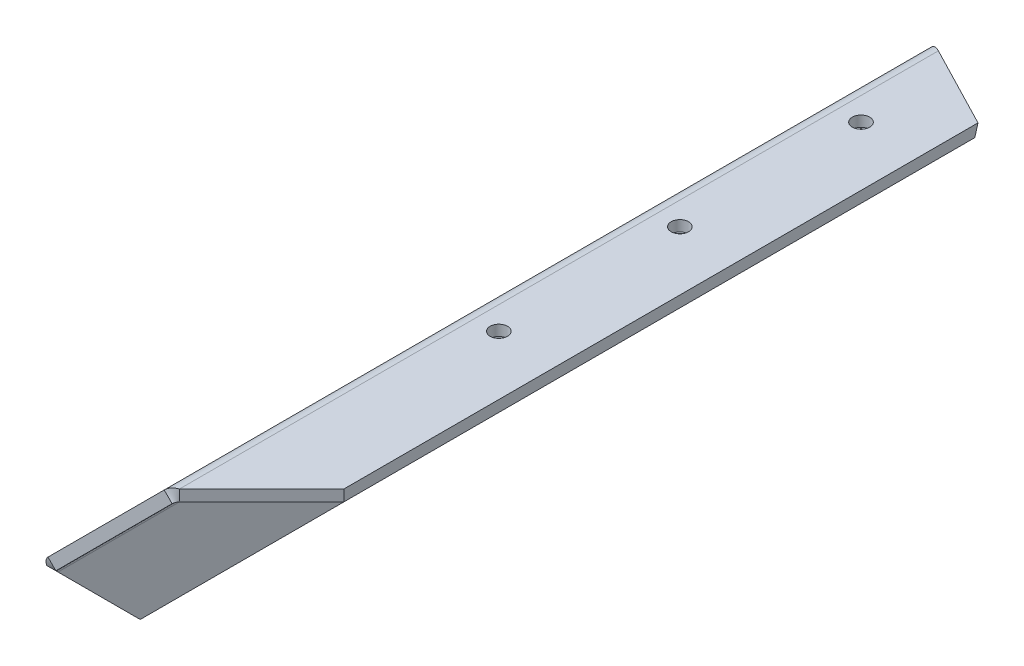
ISO-10303-21;
HEADER;
FILE_DESCRIPTION(('STEP AP214'),'2;1');
FILE_NAME('part.step','',(''),(''),'','','');
FILE_SCHEMA(('AUTOMOTIVE_DESIGN { 1 0 10303 214 1 1 1 1 }'));
ENDSEC;
DATA;
#1=APPLICATION_CONTEXT('core data for automotive mechanical design processes');
#2=APPLICATION_PROTOCOL_DEFINITION('international standard','automotive_design',2000,#1);
#3=PRODUCT_CONTEXT('',#1,'mechanical');
#4=PRODUCT('Part','Part','',(#3));
#5=PRODUCT_RELATED_PRODUCT_CATEGORY('part','',(#4));
#6=PRODUCT_DEFINITION_FORMATION('','',#4);
#7=PRODUCT_DEFINITION_CONTEXT('part definition',#1,'design');
#8=PRODUCT_DEFINITION('design','',#6,#7);
#9=PRODUCT_DEFINITION_SHAPE('','',#8);
#10=(LENGTH_UNIT() NAMED_UNIT(*) SI_UNIT(.MILLI.,.METRE.));
#11=(NAMED_UNIT(*) PLANE_ANGLE_UNIT() SI_UNIT($,.RADIAN.));
#12=(NAMED_UNIT(*) SI_UNIT($,.STERADIAN.) SOLID_ANGLE_UNIT());
#13=UNCERTAINTY_MEASURE_WITH_UNIT(LENGTH_MEASURE(1.E-05),#10,'distance_accuracy_value','');
#14=(GEOMETRIC_REPRESENTATION_CONTEXT(3) GLOBAL_UNCERTAINTY_ASSIGNED_CONTEXT((#13)) GLOBAL_UNIT_ASSIGNED_CONTEXT((#10,
#11,#12)) REPRESENTATION_CONTEXT('',''));
#15=CARTESIAN_POINT('',(0.,0.,0.));
#16=DIRECTION('',(0.,0.,1.));
#17=DIRECTION('',(1.,0.,0.));
#18=AXIS2_PLACEMENT_3D('',#15,#16,#17);
#19=CARTESIAN_POINT('',(-93.8086894866069,111.769201728745,112.900713999999));
#20=DIRECTION('',(0.707106781186544,-0.707106781186551,0.));
#21=DIRECTION('',(0.,0.,-1.));
#22=AXIS2_PLACEMENT_3D('',#19,#20,#21);
#23=PLANE('',#22);
#24=DIRECTION('',(0.,0.,-1.));
#25=VECTOR('',#24,1.);
#26=CARTESIAN_POINT('',(-111.084768855022,94.4931223603303,-112.900714000001));
#27=LINE('',#26,#25);
#28=CARTESIAN_POINT('',(-111.084768855022,94.4931223603303,-17.956016192537));
#29=VERTEX_POINT('',#28);
#30=CARTESIAN_POINT('',(-111.084768855022,94.4931223603304,94.4931223603293));
#31=VERTEX_POINT('',#30);
#32=EDGE_CURVE('E36',#29,#31,#27,.F.);
#33=ORIENTED_EDGE('',*,*,#32,.F.);
#34=DIRECTION('',(0.697714169620552,0.697714169620545,0.162449607637007));
#35=VECTOR('',#34,1.);
#36=CARTESIAN_POINT('',(-79.4328572523152,126.145033963037,-10.5864645269641));
#37=LINE('',#36,#35);
#38=CARTESIAN_POINT('',(-94.4931223603302,111.084768855022,-14.092963698447));
#39=VERTEX_POINT('',#38);
#40=EDGE_CURVE('E210',#29,#39,#37,.T.);
#41=ORIENTED_EDGE('',*,*,#40,.T.);
#42=DIRECTION('',(0.,0.,1.));
#43=VECTOR('',#42,1.);
#44=CARTESIAN_POINT('',(-94.4931223603302,111.084768855022,112.900713999999));
#45=LINE('',#44,#43);
#46=CARTESIAN_POINT('',(-94.4931223603302,111.084768855022,94.4931223603293));
#47=VERTEX_POINT('',#46);
#48=EDGE_CURVE('E104',#47,#39,#45,.F.);
#49=ORIENTED_EDGE('',*,*,#48,.F.);
#50=DIRECTION('',(-0.707106781186551,-0.707106781186544,0.));
#51=VECTOR('',#50,1.);
#52=CARTESIAN_POINT('',(-94.4931223603302,111.084768855022,94.4931223603293));
#53=LINE('',#52,#51);
#54=EDGE_CURVE('E228',#47,#31,#53,.T.);
#55=ORIENTED_EDGE('',*,*,#54,.T.);
#56=EDGE_LOOP('',(#33,#41,#49,#55));
#57=FACE_BOUND('',#56,.T.);
#58=ADVANCED_FACE('F32',(#57),#23,.T.);
#59=CARTESIAN_POINT('',(-94.9402017578616,112.900714,112.900713999999));
#60=DIRECTION('',(0.707106781186544,-0.707106781186551,0.));
#61=DIRECTION('',(0.,0.,-1.));
#62=AXIS2_PLACEMENT_3D('',#59,#60,#61);
#63=PLANE('',#62);
#64=DIRECTION('',(0.697714169620552,0.697714169620545,0.162449607637007));
#65=VECTOR('',#64,1.);
#66=CARTESIAN_POINT('',(-80.4613330721496,127.379582685712,-11.471538897891));
#67=LINE('',#66,#65);
#68=CARTESIAN_POINT('',(-112.216281126277,95.6246346315851,-18.8650806611778));
#69=VERTEX_POINT('',#68);
#70=CARTESIAN_POINT('',(-95.6246346315849,112.216281126277,-15.0020281670877));
#71=VERTEX_POINT('',#70);
#72=EDGE_CURVE('E207',#69,#71,#67,.T.);
#73=ORIENTED_EDGE('',*,*,#72,.F.);
#74=DIRECTION('',(0.,0.,-1.));
#75=VECTOR('',#74,1.);
#76=CARTESIAN_POINT('',(-112.216281126277,95.6246346315851,-112.900714000001));
#77=LINE('',#76,#75);
#78=CARTESIAN_POINT('',(-112.216281126277,95.6246346315851,94.4931223603293));
#79=VERTEX_POINT('',#78);
#80=EDGE_CURVE('E42',#69,#79,#77,.F.);
#81=ORIENTED_EDGE('',*,*,#80,.T.);
#82=DIRECTION('',(0.707106781186551,0.707106781186544,0.));
#83=VECTOR('',#82,1.);
#84=CARTESIAN_POINT('',(-94.9402017578616,112.900714,94.4931223603293));
#85=LINE('',#84,#83);
#86=CARTESIAN_POINT('',(-95.6246346315849,112.216281126277,94.4931223603293));
#87=VERTEX_POINT('',#86);
#88=EDGE_CURVE('E229',#87,#79,#85,.F.);
#89=ORIENTED_EDGE('',*,*,#88,.F.);
#90=DIRECTION('',(0.,0.,1.));
#91=VECTOR('',#90,1.);
#92=CARTESIAN_POINT('',(-95.6246346315849,112.216281126277,112.900713999999));
#93=LINE('',#92,#91);
#94=EDGE_CURVE('E110',#87,#71,#93,.F.);
#95=ORIENTED_EDGE('',*,*,#94,.T.);
#96=EDGE_LOOP('',(#73,#81,#89,#95));
#97=FACE_BOUND('',#96,.T.);
#98=ADVANCED_FACE('F34',(#97),#63,.F.);
#99=CARTESIAN_POINT('',(-93.9722675053082,110.563914,112.900713999999));
#100=DIRECTION('',(0.,0.,1.));
#101=DIRECTION('',(0.,1.,0.));
#102=AXIS2_PLACEMENT_3D('',#99,#100,#101);
#103=CYLINDRICAL_SURFACE('',#102,2.3368);
#104=DIRECTION('',(0.,0.,1.));
#105=VECTOR('',#104,1.);
#106=CARTESIAN_POINT('',(-93.9722675053082,112.900714,-112.900714000001));
#107=LINE('',#106,#105);
#108=CARTESIAN_POINT('',(-93.9722675053082,112.900714,93.9722675053073));
#109=VERTEX_POINT('',#108);
#110=CARTESIAN_POINT('',(-93.9722675053082,112.900714,-14.3411658246829));
#111=VERTEX_POINT('',#110);
#112=EDGE_CURVE('E96',#109,#111,#107,.F.);
#113=ORIENTED_EDGE('',*,*,#112,.T.);
#114=CARTESIAN_POINT('',(-93.9722675053082,110.563914,-13.6745054509774));
#115=DIRECTION('',(0.445952793407952,-0.245551475215283,-0.860715155595185));
#116=DIRECTION('',(0.753974155692041,-0.41515485257879,0.509086850084302));
#117=AXIS2_PLACEMENT_3D('',#114,#115,#116);
#118=ELLIPSE('',#117,2.7149516129806,2.3368);
#119=EDGE_CURVE('E216',#111,#71,#118,.F.);
#120=ORIENTED_EDGE('',*,*,#119,.T.);
#121=ORIENTED_EDGE('',*,*,#94,.F.);
#122=CARTESIAN_POINT('',(-93.9722675053082,110.563914,93.9722675053073));
#123=DIRECTION('',(-0.300635186420926,0.,-0.953739212093985));
#124=DIRECTION('',(-0.953739212093985,0.,0.300635186420926));
#125=AXIS2_PLACEMENT_3D('',#122,#123,#124);
#126=ELLIPSE('',#125,2.45014566913887,2.3368);
#127=EDGE_CURVE('E155',#109,#87,#126,.F.);
#128=ORIENTED_EDGE('',*,*,#127,.F.);
#129=EDGE_LOOP('',(#113,#120,#121,#128));
#130=FACE_BOUND('',#129,.T.);
#131=ADVANCED_FACE('F296',(#130),#103,.T.);
#132=CARTESIAN_POINT('',(-93.9722675053082,110.563914,112.900713999999));
#133=DIRECTION('',(0.,0.,1.));
#134=DIRECTION('',(0.,1.,0.));
#135=AXIS2_PLACEMENT_3D('',#132,#133,#134);
#136=CYLINDRICAL_SURFACE('',#135,0.736599999999998);
#137=CARTESIAN_POINT('',(-93.9722675053082,110.563914,-13.6745054509774));
#138=DIRECTION('',(0.445952793407952,-0.245551475215283,-0.860715155595185));
#139=DIRECTION('',(0.753974155692041,-0.41515485257879,0.509086850084302));
#140=AXIS2_PLACEMENT_3D('',#137,#138,#139);
#141=ELLIPSE('',#140,0.855799964961276,0.736599999999998);
#142=CARTESIAN_POINT('',(-93.9722675053082,111.300514,-13.8846483948628));
#143=VERTEX_POINT('',#142);
#144=EDGE_CURVE('E213',#143,#39,#141,.F.);
#145=ORIENTED_EDGE('',*,*,#144,.F.);
#146=DIRECTION('',(0.,0.,1.));
#147=VECTOR('',#146,1.);
#148=CARTESIAN_POINT('',(-93.9722675053082,111.300514,-112.900714000001));
#149=LINE('',#148,#147);
#150=CARTESIAN_POINT('',(-93.9722675053082,111.300514,93.9722675053073));
#151=VERTEX_POINT('',#150);
#152=EDGE_CURVE('E93',#143,#151,#149,.T.);
#153=ORIENTED_EDGE('',*,*,#152,.T.);
#154=CARTESIAN_POINT('',(-93.9722675053082,110.563914,93.9722675053073));
#155=DIRECTION('',(-0.707106781186546,0.,-0.707106781186549));
#156=DIRECTION('',(-0.707106781186549,0.,0.707106781186546));
#157=AXIS2_PLACEMENT_3D('',#154,#155,#156);
#158=ELLIPSE('',#157,1.04170971004402,0.736599999999998);
#159=EDGE_CURVE('E139',#151,#47,#158,.F.);
#160=ORIENTED_EDGE('',*,*,#159,.T.);
#161=ORIENTED_EDGE('',*,*,#48,.T.);
#162=EDGE_LOOP('',(#145,#153,#160,#161));
#163=FACE_BOUND('',#162,.T.);
#164=ADVANCED_FACE('F313',(#163),#136,.F.);
#165=CARTESIAN_POINT('',(-82.2402017578616,112.900714,-112.900714000001));
#166=DIRECTION('',(0.,-1.,0.));
#167=DIRECTION('',(1.,0.,0.));
#168=AXIS2_PLACEMENT_3D('',#165,#166,#167);
#169=PLANE('',#168);
#170=CARTESIAN_POINT('',(-90.675714,112.900714,-9.36190769008373E-13));
#171=DIRECTION('',(0.,1.,0.));
#172=DIRECTION('',(-1.,0.,0.));
#173=AXIS2_PLACEMENT_3D('',#170,#171,#172);
#174=CIRCLE('',#173,1.2446);
#175=CARTESIAN_POINT('',(-91.920314,112.900714,-9.35926266122143E-13));
#176=VERTEX_POINT('',#175);
#177=EDGE_CURVE('E144',#176,#176,#174,.T.);
#178=ORIENTED_EDGE('',*,*,#177,.F.);
#179=EDGE_LOOP('',(#178));
#180=FACE_BOUND('',#179,.T.);
#181=CARTESIAN_POINT('',(-90.675714,112.900714,25.8439284999991));
#182=DIRECTION('',(0.,1.,0.));
#183=DIRECTION('',(-1.,0.,0.));
#184=AXIS2_PLACEMENT_3D('',#181,#182,#183);
#185=CIRCLE('',#184,1.2446);
#186=CARTESIAN_POINT('',(-91.920314,112.900714,25.8439284999991));
#187=VERTEX_POINT('',#186);
#188=EDGE_CURVE('E149',#187,#187,#185,.T.);
#189=ORIENTED_EDGE('',*,*,#188,.F.);
#190=EDGE_LOOP('',(#189));
#191=FACE_BOUND('',#190,.T.);
#192=CARTESIAN_POINT('',(-90.675714,112.900714,51.6878569999991));
#193=DIRECTION('',(0.,1.,0.));
#194=DIRECTION('',(-1.,0.,0.));
#195=AXIS2_PLACEMENT_3D('',#192,#193,#194);
#196=CIRCLE('',#195,1.2446);
#197=CARTESIAN_POINT('',(-91.920314,112.900714,51.6878569999991));
#198=VERTEX_POINT('',#197);
#199=EDGE_CURVE('E232',#198,#198,#196,.T.);
#200=ORIENTED_EDGE('',*,*,#199,.F.);
#201=EDGE_LOOP('',(#200));
#202=FACE_BOUND('',#201,.T.);
#203=DIRECTION('',(0.887899482968571,0.,0.460037507323201));
#204=VECTOR('',#203,1.);
#205=CARTESIAN_POINT('',(-124.981441082724,112.900714,-30.4076048646206));
#206=LINE('',#205,#204);
#207=CARTESIAN_POINT('',(-82.2402017578616,112.900714,-8.26256077339663));
#208=VERTEX_POINT('',#207);
#209=EDGE_CURVE('E222',#111,#208,#206,.T.);
#210=ORIENTED_EDGE('',*,*,#209,.F.);
#211=ORIENTED_EDGE('',*,*,#112,.F.);
#212=DIRECTION('',(0.707106781186549,0.,-0.707106781186546));
#213=VECTOR('',#212,1.);
#214=CARTESIAN_POINT('',(15.3302561210693,112.900714,-15.3302561210697));
#215=LINE('',#214,#213);
#216=CARTESIAN_POINT('',(-82.2402017578616,112.900714,82.2402017578608));
#217=VERTEX_POINT('',#216);
#218=EDGE_CURVE('E251',#109,#217,#215,.T.);
#219=ORIENTED_EDGE('',*,*,#218,.T.);
#220=DIRECTION('',(0.,0.,-1.));
#221=VECTOR('',#220,1.);
#222=CARTESIAN_POINT('',(-82.2402017578616,112.900714,-112.900714000001));
#223=LINE('',#222,#221);
#224=EDGE_CURVE('E101',#217,#208,#223,.T.);
#225=ORIENTED_EDGE('',*,*,#224,.T.);
#226=EDGE_LOOP('',(#210,#211,#219,#225));
#227=FACE_BOUND('',#226,.T.);
#228=ADVANCED_FACE('F316',(#180,#191,#202,#227),#169,.F.);
#229=CARTESIAN_POINT('',(-82.2402017578616,111.300514,-112.900714000001));
#230=DIRECTION('',(0.,-1.,0.));
#231=DIRECTION('',(1.,0.,0.));
#232=AXIS2_PLACEMENT_3D('',#229,#230,#231);
#233=PLANE('',#232);
#234=CARTESIAN_POINT('',(-90.675714,111.300514,-9.36013111119972E-13));
#235=DIRECTION('',(0.,-1.,0.));
#236=DIRECTION('',(1.,0.,0.));
#237=AXIS2_PLACEMENT_3D('',#234,#235,#236);
#238=CIRCLE('',#237,1.11778190344489);
#239=CARTESIAN_POINT('',(-89.5579320965551,111.300514,-9.36250662573964E-13));
#240=VERTEX_POINT('',#239);
#241=EDGE_CURVE('E136',#240,#240,#238,.T.);
#242=ORIENTED_EDGE('',*,*,#241,.F.);
#243=EDGE_LOOP('',(#242));
#244=FACE_BOUND('',#243,.T.);
#245=CARTESIAN_POINT('',(-90.675714,111.300514,25.8439284999991));
#246=DIRECTION('',(0.,-1.,0.));
#247=DIRECTION('',(1.,0.,0.));
#248=AXIS2_PLACEMENT_3D('',#245,#246,#247);
#249=CIRCLE('',#248,1.11778190344489);
#250=CARTESIAN_POINT('',(-89.5579320965551,111.300514,25.8439284999991));
#251=VERTEX_POINT('',#250);
#252=EDGE_CURVE('E141',#251,#251,#249,.T.);
#253=ORIENTED_EDGE('',*,*,#252,.F.);
#254=EDGE_LOOP('',(#253));
#255=FACE_BOUND('',#254,.T.);
#256=CARTESIAN_POINT('',(-90.675714,111.300514,51.6878569999991));
#257=DIRECTION('',(0.,-1.,0.));
#258=DIRECTION('',(1.,0.,0.));
#259=AXIS2_PLACEMENT_3D('',#256,#257,#258);
#260=CIRCLE('',#259,1.11778190344489);
#261=CARTESIAN_POINT('',(-89.5579320965551,111.300514,51.6878569999991));
#262=VERTEX_POINT('',#261);
#263=EDGE_CURVE('E146',#262,#262,#260,.T.);
#264=ORIENTED_EDGE('',*,*,#263,.F.);
#265=EDGE_LOOP('',(#264));
#266=FACE_BOUND('',#265,.T.);
#267=ORIENTED_EDGE('',*,*,#152,.F.);
#268=DIRECTION('',(0.887899482968571,0.,0.460037507323201));
#269=VECTOR('',#268,1.);
#270=CARTESIAN_POINT('',(-125.167913417357,111.300514,-30.0477022765198));
#271=LINE('',#270,#269);
#272=CARTESIAN_POINT('',(-82.2402017578616,111.300514,-7.80604334357657));
#273=VERTEX_POINT('',#272);
#274=EDGE_CURVE('E219',#143,#273,#271,.T.);
#275=ORIENTED_EDGE('',*,*,#274,.T.);
#276=DIRECTION('',(0.,0.,1.));
#277=VECTOR('',#276,1.);
#278=CARTESIAN_POINT('',(-82.2402017578616,111.300514,-112.900714000001));
#279=LINE('',#278,#277);
#280=CARTESIAN_POINT('',(-82.2402017578616,111.300514,82.2402017578608));
#281=VERTEX_POINT('',#280);
#282=EDGE_CURVE('E105',#281,#273,#279,.F.);
#283=ORIENTED_EDGE('',*,*,#282,.F.);
#284=DIRECTION('',(0.707106781186549,0.,-0.707106781186546));
#285=VECTOR('',#284,1.);
#286=CARTESIAN_POINT('',(15.3302561210693,111.300514,-15.3302561210697));
#287=LINE('',#286,#285);
#288=EDGE_CURVE('E154',#151,#281,#287,.T.);
#289=ORIENTED_EDGE('',*,*,#288,.F.);
#290=EDGE_LOOP('',(#267,#275,#283,#289));
#291=FACE_BOUND('',#290,.T.);
#292=ADVANCED_FACE('F323',(#244,#255,#266,#291),#233,.T.);
#293=CARTESIAN_POINT('',(-82.2402017578616,112.900714,-112.900714000001));
#294=DIRECTION('',(-1.,0.,0.));
#295=DIRECTION('',(0.,-1.,0.));
#296=AXIS2_PLACEMENT_3D('',#293,#294,#295);
#297=PLANE('',#296);
#298=DIRECTION('',(0.,-0.961632224178945,0.274341876899344));
#299=VECTOR('',#298,1.);
#300=CARTESIAN_POINT('',(-82.2402017578616,140.505931908668,-16.1379908004483));
#301=LINE('',#300,#299);
#302=EDGE_CURVE('E225',#208,#273,#301,.T.);
#303=ORIENTED_EDGE('',*,*,#302,.F.);
#304=ORIENTED_EDGE('',*,*,#224,.F.);
#305=DIRECTION('',(0.,-1.,0.));
#306=VECTOR('',#305,1.);
#307=CARTESIAN_POINT('',(-82.2402017578616,111.300514,82.2402017578608));
#308=LINE('',#307,#306);
#309=EDGE_CURVE('E257',#281,#217,#308,.F.);
#310=ORIENTED_EDGE('',*,*,#309,.F.);
#311=ORIENTED_EDGE('',*,*,#282,.T.);
#312=EDGE_LOOP('',(#303,#304,#310,#311));
#313=FACE_BOUND('',#312,.T.);
#314=ADVANCED_FACE('F304',(#313),#297,.F.);
#315=CARTESIAN_POINT('',(-110.563914,93.9722675053083,-112.900714000001));
#316=DIRECTION('',(0.,0.,-1.));
#317=DIRECTION('',(-1.,0.,0.));
#318=AXIS2_PLACEMENT_3D('',#315,#316,#317);
#319=CYLINDRICAL_SURFACE('',#318,2.3368);
#320=ORIENTED_EDGE('',*,*,#80,.F.);
#321=CARTESIAN_POINT('',(-110.563914,93.9722675053083,-17.5375579450674));
#322=DIRECTION('',(0.445952793407952,-0.245551475215283,-0.860715155595185));
#323=DIRECTION('',(-0.753974155692041,0.41515485257879,-0.509086850084302));
#324=AXIS2_PLACEMENT_3D('',#321,#322,#323);
#325=ELLIPSE('',#324,2.7149516129806,2.3368);
#326=CARTESIAN_POINT('',(-112.900714,93.9722675053084,-18.7482982008436));
#327=VERTEX_POINT('',#326);
#328=EDGE_CURVE('E204',#69,#327,#325,.F.);
#329=ORIENTED_EDGE('',*,*,#328,.T.);
#330=DIRECTION('',(0.,0.,-1.));
#331=VECTOR('',#330,1.);
#332=CARTESIAN_POINT('',(-112.900714,93.9722675053084,112.900713999999));
#333=LINE('',#332,#331);
#334=CARTESIAN_POINT('',(-112.900714,93.9722675053084,93.9722675053073));
#335=VERTEX_POINT('',#334);
#336=EDGE_CURVE('E115',#327,#335,#333,.F.);
#337=ORIENTED_EDGE('',*,*,#336,.T.);
#338=CARTESIAN_POINT('',(-110.563914,93.9722675053084,93.9722675053073));
#339=DIRECTION('',(0.,-0.300635186420936,0.953739212093982));
#340=DIRECTION('',(0.,-0.953739212093982,-0.300635186420936));
#341=AXIS2_PLACEMENT_3D('',#338,#339,#340);
#342=ELLIPSE('',#341,2.45014566913888,2.3368);
#343=EDGE_CURVE('E168',#335,#79,#342,.F.);
#344=ORIENTED_EDGE('',*,*,#343,.T.);
#345=EDGE_LOOP('',(#320,#329,#337,#344));
#346=FACE_BOUND('',#345,.T.);
#347=ADVANCED_FACE('F301',(#346),#319,.T.);
#348=CARTESIAN_POINT('',(-110.563914,93.9722675053083,-112.900714000001));
#349=DIRECTION('',(0.,0.,-1.));
#350=DIRECTION('',(-1.,0.,0.));
#351=AXIS2_PLACEMENT_3D('',#348,#349,#350);
#352=CYLINDRICAL_SURFACE('',#351,0.736599999999999);
#353=CARTESIAN_POINT('',(-110.563914,93.9722675053083,-17.5375579450674));
#354=DIRECTION('',(0.445952793407952,-0.245551475215283,-0.860715155595185));
#355=DIRECTION('',(-0.753974155692041,0.41515485257879,-0.509086850084302));
#356=AXIS2_PLACEMENT_3D('',#353,#354,#355);
#357=ELLIPSE('',#356,0.855799964961277,0.736599999999999);
#358=CARTESIAN_POINT('',(-111.300514,93.9722675053084,-17.9192043300403));
#359=VERTEX_POINT('',#358);
#360=EDGE_CURVE('E200',#29,#359,#357,.F.);
#361=ORIENTED_EDGE('',*,*,#360,.F.);
#362=ORIENTED_EDGE('',*,*,#32,.T.);
#363=CARTESIAN_POINT('',(-110.563914,93.9722675053084,93.9722675053073));
#364=DIRECTION('',(0.,-0.707106781186546,0.707106781186549));
#365=DIRECTION('',(0.,-0.707106781186549,-0.707106781186546));
#366=AXIS2_PLACEMENT_3D('',#363,#364,#365);
#367=ELLIPSE('',#366,1.04170971004402,0.736599999999999);
#368=CARTESIAN_POINT('',(-111.300514,93.9722675053084,93.9722675053073));
#369=VERTEX_POINT('',#368);
#370=EDGE_CURVE('E124',#369,#31,#367,.F.);
#371=ORIENTED_EDGE('',*,*,#370,.F.);
#372=DIRECTION('',(0.,0.,-1.));
#373=VECTOR('',#372,1.);
#374=CARTESIAN_POINT('',(-111.300514,93.9722675053084,112.900713999999));
#375=LINE('',#374,#373);
#376=EDGE_CURVE('E112',#369,#359,#375,.T.);
#377=ORIENTED_EDGE('',*,*,#376,.T.);
#378=EDGE_LOOP('',(#361,#362,#371,#377));
#379=FACE_BOUND('',#378,.T.);
#380=ADVANCED_FACE('F192',(#379),#352,.F.);
#381=CARTESIAN_POINT('',(-112.900714,94.2773772153524,-112.900714000001));
#382=DIRECTION('',(1.,0.,0.));
#383=DIRECTION('',(0.,1.,0.));
#384=AXIS2_PLACEMENT_3D('',#381,#382,#383);
#385=PLANE('',#384);
#386=CARTESIAN_POINT('',(-112.900714,90.6757140000002,-9.29000032510604E-13));
#387=DIRECTION('',(-1.,0.,0.));
#388=DIRECTION('',(0.,-1.,0.));
#389=AXIS2_PLACEMENT_3D('',#386,#387,#388);
#390=CIRCLE('',#389,1.2446);
#391=CARTESIAN_POINT('',(-112.900714,89.4311140000002,-9.28861854152959E-13));
#392=VERTEX_POINT('',#391);
#393=EDGE_CURVE('E129',#392,#392,#390,.T.);
#394=ORIENTED_EDGE('',*,*,#393,.F.);
#395=EDGE_LOOP('',(#394));
#396=FACE_BOUND('',#395,.T.);
#397=CARTESIAN_POINT('',(-112.900714,90.6757140000002,25.8439284999991));
#398=DIRECTION('',(-1.,0.,0.));
#399=DIRECTION('',(0.,-1.,0.));
#400=AXIS2_PLACEMENT_3D('',#397,#398,#399);
#401=CIRCLE('',#400,1.2446);
#402=CARTESIAN_POINT('',(-112.900714,89.4311140000002,25.8439284999991));
#403=VERTEX_POINT('',#402);
#404=EDGE_CURVE('E134',#403,#403,#401,.T.);
#405=ORIENTED_EDGE('',*,*,#404,.F.);
#406=EDGE_LOOP('',(#405));
#407=FACE_BOUND('',#406,.T.);
#408=CARTESIAN_POINT('',(-112.900714,90.6757140000002,51.6878569999991));
#409=DIRECTION('',(-1.,0.,0.));
#410=DIRECTION('',(0.,-1.,0.));
#411=AXIS2_PLACEMENT_3D('',#408,#409,#410);
#412=CIRCLE('',#411,1.2446);
#413=CARTESIAN_POINT('',(-112.900714,89.4311140000002,51.6878569999991));
#414=VERTEX_POINT('',#413);
#415=EDGE_CURVE('E260',#414,#414,#412,.T.);
#416=ORIENTED_EDGE('',*,*,#415,.F.);
#417=EDGE_LOOP('',(#416));
#418=FACE_BOUND('',#417,.T.);
#419=DIRECTION('',(0.,0.961632224178947,-0.274341876899339));
#420=VECTOR('',#419,1.);
#421=CARTESIAN_POINT('',(-112.900714,119.093326317281,-25.9150281116049));
#422=LINE('',#421,#420);
#423=CARTESIAN_POINT('',(-112.900714,82.2402017578618,-15.401283764208));
#424=VERTEX_POINT('',#423);
#425=EDGE_CURVE('E80',#424,#327,#422,.T.);
#426=ORIENTED_EDGE('',*,*,#425,.F.);
#427=DIRECTION('',(0.,0.,1.));
#428=VECTOR('',#427,1.);
#429=CARTESIAN_POINT('',(-112.900714,82.2402017578618,-112.900714000001));
#430=LINE('',#429,#428);
#431=CARTESIAN_POINT('',(-112.900714,82.2402017578618,82.2402017578608));
#432=VERTEX_POINT('',#431);
#433=EDGE_CURVE('E73',#424,#432,#430,.T.);
#434=ORIENTED_EDGE('',*,*,#433,.T.);
#435=DIRECTION('',(0.,0.707106781186549,0.707106781186546));
#436=VECTOR('',#435,1.);
#437=CARTESIAN_POINT('',(-112.900714,112.900714,112.900713999999));
#438=LINE('',#437,#436);
#439=EDGE_CURVE('E77',#432,#335,#438,.T.);
#440=ORIENTED_EDGE('',*,*,#439,.T.);
#441=ORIENTED_EDGE('',*,*,#336,.F.);
#442=EDGE_LOOP('',(#426,#434,#440,#441));
#443=FACE_BOUND('',#442,.T.);
#444=ADVANCED_FACE('F75',(#396,#407,#418,#443),#385,.F.);
#445=CARTESIAN_POINT('',(-111.300514,94.2773772153523,-112.900714000001));
#446=DIRECTION('',(1.,0.,0.));
#447=DIRECTION('',(0.,1.,0.));
#448=AXIS2_PLACEMENT_3D('',#445,#446,#447);
#449=PLANE('',#448);
#450=CARTESIAN_POINT('',(-111.300514,90.6757140000002,-9.29340107650043E-13));
#451=DIRECTION('',(1.,0.,0.));
#452=DIRECTION('',(0.,1.,0.));
#453=AXIS2_PLACEMENT_3D('',#450,#451,#452);
#454=CIRCLE('',#453,1.11778190344489);
#455=CARTESIAN_POINT('',(-111.300514,91.793495903445,-9.29464206370614E-13));
#456=VERTEX_POINT('',#455);
#457=EDGE_CURVE('E121',#456,#456,#454,.T.);
#458=ORIENTED_EDGE('',*,*,#457,.F.);
#459=EDGE_LOOP('',(#458));
#460=FACE_BOUND('',#459,.T.);
#461=CARTESIAN_POINT('',(-111.300514,90.6757140000002,25.8439284999991));
#462=DIRECTION('',(1.,0.,0.));
#463=DIRECTION('',(0.,1.,0.));
#464=AXIS2_PLACEMENT_3D('',#461,#462,#463);
#465=CIRCLE('',#464,1.11778190344489);
#466=CARTESIAN_POINT('',(-111.300514,91.7934959034451,25.8439284999991));
#467=VERTEX_POINT('',#466);
#468=EDGE_CURVE('E126',#467,#467,#465,.T.);
#469=ORIENTED_EDGE('',*,*,#468,.F.);
#470=EDGE_LOOP('',(#469));
#471=FACE_BOUND('',#470,.T.);
#472=CARTESIAN_POINT('',(-111.300514,90.6757140000002,51.6878569999991));
#473=DIRECTION('',(1.,0.,0.));
#474=DIRECTION('',(0.,1.,0.));
#475=AXIS2_PLACEMENT_3D('',#472,#473,#474);
#476=CIRCLE('',#475,1.11778190344489);
#477=CARTESIAN_POINT('',(-111.300514,91.7934959034451,51.6878569999991));
#478=VERTEX_POINT('',#477);
#479=EDGE_CURVE('E131',#478,#478,#476,.T.);
#480=ORIENTED_EDGE('',*,*,#479,.F.);
#481=EDGE_LOOP('',(#480));
#482=FACE_BOUND('',#481,.T.);
#483=DIRECTION('',(0.,0.,-1.));
#484=VECTOR('',#483,1.);
#485=CARTESIAN_POINT('',(-111.300514,82.2402017578618,112.900713999999));
#486=LINE('',#485,#484);
#487=CARTESIAN_POINT('',(-111.300514,82.2402017578618,-14.5721898934047));
#488=VERTEX_POINT('',#487);
#489=CARTESIAN_POINT('',(-111.300514,82.2402017578618,82.2402017578608));
#490=VERTEX_POINT('',#489);
#491=EDGE_CURVE('E56',#488,#490,#486,.F.);
#492=ORIENTED_EDGE('',*,*,#491,.F.);
#493=DIRECTION('',(0.,0.961632224178947,-0.274341876899339));
#494=VECTOR('',#493,1.);
#495=CARTESIAN_POINT('',(-111.300514,119.312054537003,-25.1483347186773));
#496=LINE('',#495,#494);
#497=EDGE_CURVE('E48',#488,#359,#496,.T.);
#498=ORIENTED_EDGE('',*,*,#497,.T.);
#499=ORIENTED_EDGE('',*,*,#376,.F.);
#500=DIRECTION('',(0.,0.707106781186549,0.707106781186546));
#501=VECTOR('',#500,1.);
#502=CARTESIAN_POINT('',(-111.300514,112.900714,112.900713999999));
#503=LINE('',#502,#501);
#504=EDGE_CURVE('E89',#490,#369,#503,.T.);
#505=ORIENTED_EDGE('',*,*,#504,.F.);
#506=EDGE_LOOP('',(#492,#498,#499,#505));
#507=FACE_BOUND('',#506,.T.);
#508=ADVANCED_FACE('F196',(#460,#471,#482,#507),#449,.T.);
#509=CARTESIAN_POINT('',(-112.900714,82.2402017578618,112.900713999999));
#510=DIRECTION('',(0.,1.,0.));
#511=DIRECTION('',(-1.,0.,0.));
#512=AXIS2_PLACEMENT_3D('',#509,#510,#511);
#513=PLANE('',#512);
#514=DIRECTION('',(-0.88789948296857,0.,-0.460037507323203));
#515=VECTOR('',#514,1.);
#516=CARTESIAN_POINT('',(-60.4935735526506,82.2402017578613,11.7518464265313));
#517=LINE('',#516,#515);
#518=EDGE_CURVE('E11',#488,#424,#517,.T.);
#519=ORIENTED_EDGE('',*,*,#518,.F.);
#520=ORIENTED_EDGE('',*,*,#491,.T.);
#521=DIRECTION('',(-1.,0.,0.));
#522=VECTOR('',#521,1.);
#523=CARTESIAN_POINT('',(-112.900714,82.2402017578618,82.2402017578608));
#524=LINE('',#523,#522);
#525=EDGE_CURVE('E85',#432,#490,#524,.F.);
#526=ORIENTED_EDGE('',*,*,#525,.F.);
#527=ORIENTED_EDGE('',*,*,#433,.F.);
#528=EDGE_LOOP('',(#519,#520,#526,#527));
#529=FACE_BOUND('',#528,.T.);
#530=ADVANCED_FACE('F92',(#529),#513,.F.);
#531=CARTESIAN_POINT('',(-112.900714,112.900714,112.900713999999));
#532=DIRECTION('',(0.,0.707106781186546,-0.707106781186549));
#533=DIRECTION('',(0.,0.707106781186549,0.707106781186546));
#534=AXIS2_PLACEMENT_3D('',#531,#532,#533);
#535=PLANE('',#534);
#536=ORIENTED_EDGE('',*,*,#439,.F.);
#537=ORIENTED_EDGE('',*,*,#525,.T.);
#538=ORIENTED_EDGE('',*,*,#504,.T.);
#539=DIRECTION('',(-1.,0.,0.));
#540=VECTOR('',#539,1.);
#541=CARTESIAN_POINT('',(-112.900714,93.9722675053084,93.9722675053073));
#542=LINE('',#541,#540);
#543=EDGE_CURVE('E88',#335,#369,#542,.F.);
#544=ORIENTED_EDGE('',*,*,#543,.F.);
#545=EDGE_LOOP('',(#536,#537,#538,#544));
#546=FACE_BOUND('',#545,.T.);
#547=ADVANCED_FACE('F84',(#546),#535,.F.);
#548=CARTESIAN_POINT('',(-110.563914,91.6354675053084,93.2356675053073));
#549=CARTESIAN_POINT('',(-110.563914,92.1688675053084,93.2356675053073));
#550=CARTESIAN_POINT('',(-110.563914,92.7022675053084,93.2356675053073));
#551=CARTESIAN_POINT('',(-110.563914,93.2356675053083,93.2356675053073));
#552=CARTESIAN_POINT('',(-115.237514,91.6354675053084,93.2356675053073));
#553=CARTESIAN_POINT('',(-114.170714,92.1688675053084,93.2356675053073));
#554=CARTESIAN_POINT('',(-113.103914,92.7022675053084,93.2356675053074));
#555=CARTESIAN_POINT('',(-112.037114,93.2356675053084,93.2356675053073));
#556=CARTESIAN_POINT('',(-115.237514,96.3090675053084,94.7088675053073));
#557=CARTESIAN_POINT('',(-114.170714,95.7756675053084,94.7088675053074));
#558=CARTESIAN_POINT('',(-113.103914,95.2422675053084,94.7088675053074));
#559=CARTESIAN_POINT('',(-112.037114,94.7088675053084,94.7088675053073));
#560=CARTESIAN_POINT('',(-110.563914,96.3090675053083,94.7088675053073));
#561=CARTESIAN_POINT('',(-110.563914,95.7756675053083,94.7088675053073));
#562=CARTESIAN_POINT('',(-110.563914,95.2422675053083,94.7088675053073));
#563=CARTESIAN_POINT('',(-110.563914,94.7088675053083,94.7088675053073));
#564=CARTESIAN_POINT('',(-105.890314,96.3090675053083,94.7088675053073));
#565=CARTESIAN_POINT('',(-106.957114,95.7756675053083,94.7088675053074));
#566=CARTESIAN_POINT('',(-108.023914,95.2422675053083,94.7088675053074));
#567=CARTESIAN_POINT('',(-109.090714,94.7088675053083,94.7088675053073));
#568=CARTESIAN_POINT('',(-105.890314,91.6354675053083,93.2356675053073));
#569=CARTESIAN_POINT('',(-106.957114,92.1688675053083,93.2356675053073));
#570=CARTESIAN_POINT('',(-108.023914,92.7022675053083,93.2356675053074));
#571=CARTESIAN_POINT('',(-109.090714,93.2356675053083,93.2356675053073));
#572=CARTESIAN_POINT('',(-110.563914,91.6354675053084,93.2356675053073));
#573=CARTESIAN_POINT('',(-110.563914,92.1688675053084,93.2356675053073));
#574=CARTESIAN_POINT('',(-110.563914,92.7022675053084,93.2356675053073));
#575=CARTESIAN_POINT('',(-110.563914,93.2356675053083,93.2356675053073));
#576=(BOUNDED_SURFACE() B_SPLINE_SURFACE(3,3,((#548,#549,#550,#551),(#552,#553,#554,#555),(#556,
#557,#558,#559),(#560,#561,#562,#563),(#564,#565,#566,#567),(#568,#569,#570,#571),(#572,#573,
#574,#575)),.UNSPECIFIED.,.T.,.F.,.F.) B_SPLINE_SURFACE_WITH_KNOTS((4,3,4),(4,4),(0.,0.5,1.),
(0.,1.),.UNSPECIFIED.) GEOMETRIC_REPRESENTATION_ITEM() RATIONAL_B_SPLINE_SURFACE(((1.,1.,1.,1.),
(0.333333333333333,0.333333333333333,0.333333333333333,0.333333333333333),(0.333333333333333,
0.333333333333333,0.333333333333333,0.333333333333333),(1.,1.,1.,1.),(0.333333333333333,
0.333333333333333,0.333333333333333,0.333333333333333),(0.333333333333333,0.333333333333333,
0.333333333333333,0.333333333333333),(1.,1.,1.,1.))) REPRESENTATION_ITEM('') SURFACE());
#577=DIRECTION('',(0.707106781186544,-0.707106781186551,0.));
#578=VECTOR('',#577,1.);
#579=CARTESIAN_POINT('',(-111.084768855022,94.4931223603304,94.4931223603293));
#580=LINE('',#579,#578);
#581=EDGE_CURVE('E90',#31,#79,#580,.F.);
#582=ORIENTED_EDGE('',*,*,#370,.T.);
#583=ORIENTED_EDGE('',*,*,#581,.T.);
#584=ORIENTED_EDGE('',*,*,#343,.F.);
#585=ORIENTED_EDGE('',*,*,#543,.T.);
#586=EDGE_LOOP('',(#582,#583,#584,#585));
#587=FACE_BOUND('',#586,.T.);
#588=ADVANCED_FACE('F188',(#587),#576,.F.);
#589=CARTESIAN_POINT('',(-111.376714,90.6757140000002,-9.29323913595784E-13));
#590=DIRECTION('',(-1.,0.,0.));
#591=DIRECTION('',(0.,-1.,0.));
#592=AXIS2_PLACEMENT_3D('',#589,#590,#591);
#593=CONICAL_SURFACE('',#592,1.2446,1.02974425867665);
#594=ORIENTED_EDGE('',*,*,#457,.T.);
#595=EDGE_LOOP('',(#594));
#596=FACE_BOUND('',#595,.T.);
#597=CARTESIAN_POINT('',(-111.376714,90.6757140000002,-9.29323913595784E-13));
#598=DIRECTION('',(-1.,0.,0.));
#599=DIRECTION('',(0.,-1.,0.));
#600=AXIS2_PLACEMENT_3D('',#597,#598,#599);
#601=CIRCLE('',#600,1.2446);
#602=CARTESIAN_POINT('',(-111.376714,89.4311140000002,-9.29185735238139E-13));
#603=VERTEX_POINT('',#602);
#604=EDGE_CURVE('E125',#603,#603,#601,.T.);
#605=ORIENTED_EDGE('',*,*,#604,.T.);
#606=EDGE_LOOP('',(#605));
#607=FACE_BOUND('',#606,.T.);
#608=ADVANCED_FACE('F276',(#596,#607),#593,.F.);
#609=CARTESIAN_POINT('',(-112.900714,90.6757140000002,-9.29000032510604E-13));
#610=DIRECTION('',(-1.,0.,0.));
#611=DIRECTION('',(0.,-1.,0.));
#612=AXIS2_PLACEMENT_3D('',#609,#610,#611);
#613=CYLINDRICAL_SURFACE('',#612,1.2446);
#614=ORIENTED_EDGE('',*,*,#604,.F.);
#615=EDGE_LOOP('',(#614));
#616=FACE_BOUND('',#615,.T.);
#617=ORIENTED_EDGE('',*,*,#393,.T.);
#618=EDGE_LOOP('',(#617));
#619=FACE_BOUND('',#618,.T.);
#620=ADVANCED_FACE('F278',(#616,#619),#613,.F.);
#621=CARTESIAN_POINT('',(-111.376714,90.6757140000002,25.8439284999991));
#622=DIRECTION('',(-1.,0.,0.));
#623=DIRECTION('',(0.,-1.,0.));
#624=AXIS2_PLACEMENT_3D('',#621,#622,#623);
#625=CONICAL_SURFACE('',#624,1.2446,1.02974425867665);
#626=ORIENTED_EDGE('',*,*,#468,.T.);
#627=EDGE_LOOP('',(#626));
#628=FACE_BOUND('',#627,.T.);
#629=CARTESIAN_POINT('',(-111.376714,90.6757140000002,25.8439284999991));
#630=DIRECTION('',(-1.,0.,0.));
#631=DIRECTION('',(0.,-1.,0.));
#632=AXIS2_PLACEMENT_3D('',#629,#630,#631);
#633=CIRCLE('',#632,1.2446);
#634=CARTESIAN_POINT('',(-111.376714,89.4311140000002,25.8439284999991));
#635=VERTEX_POINT('',#634);
#636=EDGE_CURVE('E130',#635,#635,#633,.T.);
#637=ORIENTED_EDGE('',*,*,#636,.T.);
#638=EDGE_LOOP('',(#637));
#639=FACE_BOUND('',#638,.T.);
#640=ADVANCED_FACE('F280',(#628,#639),#625,.F.);
#641=CARTESIAN_POINT('',(-112.900714,90.6757140000002,25.8439284999991));
#642=DIRECTION('',(-1.,0.,0.));
#643=DIRECTION('',(0.,-1.,0.));
#644=AXIS2_PLACEMENT_3D('',#641,#642,#643);
#645=CYLINDRICAL_SURFACE('',#644,1.2446);
#646=ORIENTED_EDGE('',*,*,#636,.F.);
#647=EDGE_LOOP('',(#646));
#648=FACE_BOUND('',#647,.T.);
#649=ORIENTED_EDGE('',*,*,#404,.T.);
#650=EDGE_LOOP('',(#649));
#651=FACE_BOUND('',#650,.T.);
#652=ADVANCED_FACE('F286',(#648,#651),#645,.F.);
#653=CARTESIAN_POINT('',(-111.376714,90.6757140000002,51.6878569999991));
#654=DIRECTION('',(-1.,0.,0.));
#655=DIRECTION('',(0.,-1.,0.));
#656=AXIS2_PLACEMENT_3D('',#653,#654,#655);
#657=CONICAL_SURFACE('',#656,1.2446,1.02974425867665);
#658=ORIENTED_EDGE('',*,*,#479,.T.);
#659=EDGE_LOOP('',(#658));
#660=FACE_BOUND('',#659,.T.);
#661=CARTESIAN_POINT('',(-111.376714,90.6757140000002,51.6878569999991));
#662=DIRECTION('',(-1.,0.,0.));
#663=DIRECTION('',(0.,-1.,0.));
#664=AXIS2_PLACEMENT_3D('',#661,#662,#663);
#665=CIRCLE('',#664,1.2446);
#666=CARTESIAN_POINT('',(-111.376714,89.4311140000002,51.6878569999991));
#667=VERTEX_POINT('',#666);
#668=EDGE_CURVE('E135',#667,#667,#665,.T.);
#669=ORIENTED_EDGE('',*,*,#668,.T.);
#670=EDGE_LOOP('',(#669));
#671=FACE_BOUND('',#670,.T.);
#672=ADVANCED_FACE('F370',(#660,#671),#657,.F.);
#673=CARTESIAN_POINT('',(-112.900714,90.6757140000002,51.6878569999991));
#674=DIRECTION('',(-1.,0.,0.));
#675=DIRECTION('',(0.,-1.,0.));
#676=AXIS2_PLACEMENT_3D('',#673,#674,#675);
#677=CYLINDRICAL_SURFACE('',#676,1.2446);
#678=ORIENTED_EDGE('',*,*,#668,.F.);
#679=EDGE_LOOP('',(#678));
#680=FACE_BOUND('',#679,.T.);
#681=ORIENTED_EDGE('',*,*,#415,.T.);
#682=EDGE_LOOP('',(#681));
#683=FACE_BOUND('',#682,.T.);
#684=ADVANCED_FACE('F380',(#680,#683),#677,.F.);
#685=CARTESIAN_POINT('',(15.3302561210693,111.300514,-15.3302561210697));
#686=DIRECTION('',(-0.707106781186546,0.,-0.707106781186549));
#687=DIRECTION('',(0.707106781186549,0.,-0.707106781186546));
#688=AXIS2_PLACEMENT_3D('',#685,#686,#687);
#689=PLANE('',#688);
#690=ORIENTED_EDGE('',*,*,#288,.T.);
#691=ORIENTED_EDGE('',*,*,#309,.T.);
#692=ORIENTED_EDGE('',*,*,#218,.F.);
#693=DIRECTION('',(0.,-1.,0.));
#694=VECTOR('',#693,1.);
#695=CARTESIAN_POINT('',(-93.9722675053082,111.300514,93.9722675053073));
#696=LINE('',#695,#694);
#697=EDGE_CURVE('E254',#151,#109,#696,.F.);
#698=ORIENTED_EDGE('',*,*,#697,.F.);
#699=EDGE_LOOP('',(#690,#691,#692,#698));
#700=FACE_BOUND('',#699,.T.);
#701=ADVANCED_FACE('F390',(#700),#689,.F.);
#702=CARTESIAN_POINT('',(-96.3090675053081,110.563914,94.7088675053073));
#703=CARTESIAN_POINT('',(-95.7756675053082,110.563914,94.7088675053073));
#704=CARTESIAN_POINT('',(-95.2422675053082,110.563914,94.7088675053073));
#705=CARTESIAN_POINT('',(-94.7088675053082,110.563914,94.7088675053073));
#706=CARTESIAN_POINT('',(-96.3090675053081,105.890314,94.7088675053073));
#707=CARTESIAN_POINT('',(-95.7756675053081,106.957114,94.7088675053073));
#708=CARTESIAN_POINT('',(-95.2422675053081,108.023914,94.7088675053073));
#709=CARTESIAN_POINT('',(-94.7088675053082,109.090714,94.7088675053073));
#710=CARTESIAN_POINT('',(-91.6354675053082,105.890314,93.2356675053073));
#711=CARTESIAN_POINT('',(-92.1688675053082,106.957114,93.2356675053073));
#712=CARTESIAN_POINT('',(-92.7022675053082,108.023914,93.2356675053073));
#713=CARTESIAN_POINT('',(-93.2356675053082,109.090714,93.2356675053073));
#714=CARTESIAN_POINT('',(-91.6354675053082,110.563914,93.2356675053073));
#715=CARTESIAN_POINT('',(-92.1688675053082,110.563914,93.2356675053073));
#716=CARTESIAN_POINT('',(-92.7022675053082,110.563914,93.2356675053073));
#717=CARTESIAN_POINT('',(-93.2356675053082,110.563914,93.2356675053073));
#718=CARTESIAN_POINT('',(-91.6354675053082,115.237514,93.2356675053073));
#719=CARTESIAN_POINT('',(-92.1688675053082,114.170714,93.2356675053073));
#720=CARTESIAN_POINT('',(-92.7022675053082,113.103914,93.2356675053073));
#721=CARTESIAN_POINT('',(-93.2356675053082,112.037114,93.2356675053073));
#722=CARTESIAN_POINT('',(-96.3090675053081,115.237514,94.7088675053073));
#723=CARTESIAN_POINT('',(-95.7756675053081,114.170714,94.7088675053073));
#724=CARTESIAN_POINT('',(-95.2422675053081,113.103914,94.7088675053073));
#725=CARTESIAN_POINT('',(-94.7088675053082,112.037114,94.7088675053073));
#726=CARTESIAN_POINT('',(-96.3090675053081,110.563914,94.7088675053073));
#727=CARTESIAN_POINT('',(-95.7756675053082,110.563914,94.7088675053073));
#728=CARTESIAN_POINT('',(-95.2422675053082,110.563914,94.7088675053073));
#729=CARTESIAN_POINT('',(-94.7088675053082,110.563914,94.7088675053073));
#730=(BOUNDED_SURFACE() B_SPLINE_SURFACE(3,3,((#702,#703,#704,#705),(#706,#707,#708,#709),(#710,
#711,#712,#713),(#714,#715,#716,#717),(#718,#719,#720,#721),(#722,#723,#724,#725),(#726,#727,
#728,#729)),.UNSPECIFIED.,.T.,.F.,.F.) B_SPLINE_SURFACE_WITH_KNOTS((4,3,4),(4,4),(0.,0.5,1.),
(0.,1.),.UNSPECIFIED.) GEOMETRIC_REPRESENTATION_ITEM() RATIONAL_B_SPLINE_SURFACE(((1.,1.,1.,1.),
(0.333333333333333,0.333333333333333,0.333333333333333,0.333333333333333),(0.333333333333333,
0.333333333333333,0.333333333333333,0.333333333333333),(1.,1.,1.,1.),(0.333333333333333,
0.333333333333333,0.333333333333333,0.333333333333333),(0.333333333333333,0.333333333333333,
0.333333333333333,0.333333333333333),(1.,1.,1.,1.))) REPRESENTATION_ITEM('') SURFACE());
#731=DIRECTION('',(0.707106781186544,-0.707106781186551,0.));
#732=VECTOR('',#731,1.);
#733=CARTESIAN_POINT('',(-94.4931223603302,111.084768855022,94.4931223603293));
#734=LINE('',#733,#732);
#735=EDGE_CURVE('E151',#47,#87,#734,.F.);
#736=ORIENTED_EDGE('',*,*,#735,.F.);
#737=ORIENTED_EDGE('',*,*,#159,.F.);
#738=ORIENTED_EDGE('',*,*,#697,.T.);
#739=ORIENTED_EDGE('',*,*,#127,.T.);
#740=EDGE_LOOP('',(#736,#737,#738,#739));
#741=FACE_BOUND('',#740,.T.);
#742=ADVANCED_FACE('F400',(#741),#730,.T.);
#743=CARTESIAN_POINT('',(-90.675714,111.376714,-9.3602157101942E-13));
#744=DIRECTION('',(0.,1.,0.));
#745=DIRECTION('',(-1.,0.,0.));
#746=AXIS2_PLACEMENT_3D('',#743,#744,#745);
#747=CONICAL_SURFACE('',#746,1.2446,1.02974425867665);
#748=ORIENTED_EDGE('',*,*,#241,.T.);
#749=EDGE_LOOP('',(#748));
#750=FACE_BOUND('',#749,.T.);
#751=CARTESIAN_POINT('',(-90.675714,111.376714,-9.3602157101942E-13));
#752=DIRECTION('',(0.,1.,0.));
#753=DIRECTION('',(-1.,0.,0.));
#754=AXIS2_PLACEMENT_3D('',#751,#752,#753);
#755=CIRCLE('',#754,1.2446);
#756=CARTESIAN_POINT('',(-91.920314,111.376714,-9.3575706813319E-13));
#757=VERTEX_POINT('',#756);
#758=EDGE_CURVE('E140',#757,#757,#755,.T.);
#759=ORIENTED_EDGE('',*,*,#758,.T.);
#760=EDGE_LOOP('',(#759));
#761=FACE_BOUND('',#760,.T.);
#762=ADVANCED_FACE('F410',(#750,#761),#747,.F.);
#763=CARTESIAN_POINT('',(-90.675714,112.900714,-9.36190769008373E-13));
#764=DIRECTION('',(0.,1.,0.));
#765=DIRECTION('',(-1.,0.,0.));
#766=AXIS2_PLACEMENT_3D('',#763,#764,#765);
#767=CYLINDRICAL_SURFACE('',#766,1.2446);
#768=ORIENTED_EDGE('',*,*,#758,.F.);
#769=EDGE_LOOP('',(#768));
#770=FACE_BOUND('',#769,.T.);
#771=ORIENTED_EDGE('',*,*,#177,.T.);
#772=EDGE_LOOP('',(#771));
#773=FACE_BOUND('',#772,.T.);
#774=ADVANCED_FACE('F420',(#770,#773),#767,.F.);
#775=CARTESIAN_POINT('',(-90.675714,111.376714,25.8439284999991));
#776=DIRECTION('',(0.,1.,0.));
#777=DIRECTION('',(-1.,0.,0.));
#778=AXIS2_PLACEMENT_3D('',#775,#776,#777);
#779=CONICAL_SURFACE('',#778,1.2446,1.02974425867665);
#780=ORIENTED_EDGE('',*,*,#252,.T.);
#781=EDGE_LOOP('',(#780));
#782=FACE_BOUND('',#781,.T.);
#783=CARTESIAN_POINT('',(-90.675714,111.376714,25.8439284999991));
#784=DIRECTION('',(0.,1.,0.));
#785=DIRECTION('',(-1.,0.,0.));
#786=AXIS2_PLACEMENT_3D('',#783,#784,#785);
#787=CIRCLE('',#786,1.2446);
#788=CARTESIAN_POINT('',(-91.920314,111.376714,25.8439284999991));
#789=VERTEX_POINT('',#788);
#790=EDGE_CURVE('E145',#789,#789,#787,.T.);
#791=ORIENTED_EDGE('',*,*,#790,.T.);
#792=EDGE_LOOP('',(#791));
#793=FACE_BOUND('',#792,.T.);
#794=ADVANCED_FACE('F430',(#782,#793),#779,.F.);
#795=CARTESIAN_POINT('',(-90.675714,112.900714,25.8439284999991));
#796=DIRECTION('',(0.,1.,0.));
#797=DIRECTION('',(-1.,0.,0.));
#798=AXIS2_PLACEMENT_3D('',#795,#796,#797);
#799=CYLINDRICAL_SURFACE('',#798,1.2446);
#800=ORIENTED_EDGE('',*,*,#790,.F.);
#801=EDGE_LOOP('',(#800));
#802=FACE_BOUND('',#801,.T.);
#803=ORIENTED_EDGE('',*,*,#188,.T.);
#804=EDGE_LOOP('',(#803));
#805=FACE_BOUND('',#804,.T.);
#806=ADVANCED_FACE('F440',(#802,#805),#799,.F.);
#807=CARTESIAN_POINT('',(-90.675714,111.376714,51.6878569999991));
#808=DIRECTION('',(0.,1.,0.));
#809=DIRECTION('',(-1.,0.,0.));
#810=AXIS2_PLACEMENT_3D('',#807,#808,#809);
#811=CONICAL_SURFACE('',#810,1.2446,1.02974425867665);
#812=ORIENTED_EDGE('',*,*,#263,.T.);
#813=EDGE_LOOP('',(#812));
#814=FACE_BOUND('',#813,.T.);
#815=CARTESIAN_POINT('',(-90.675714,111.376714,51.6878569999991));
#816=DIRECTION('',(0.,1.,0.));
#817=DIRECTION('',(-1.,0.,0.));
#818=AXIS2_PLACEMENT_3D('',#815,#816,#817);
#819=CIRCLE('',#818,1.2446);
#820=CARTESIAN_POINT('',(-91.920314,111.376714,51.6878569999991));
#821=VERTEX_POINT('',#820);
#822=EDGE_CURVE('E150',#821,#821,#819,.T.);
#823=ORIENTED_EDGE('',*,*,#822,.T.);
#824=EDGE_LOOP('',(#823));
#825=FACE_BOUND('',#824,.T.);
#826=ADVANCED_FACE('F450',(#814,#825),#811,.F.);
#827=CARTESIAN_POINT('',(-90.675714,112.900714,51.6878569999991));
#828=DIRECTION('',(0.,1.,0.));
#829=DIRECTION('',(-1.,0.,0.));
#830=AXIS2_PLACEMENT_3D('',#827,#828,#829);
#831=CYLINDRICAL_SURFACE('',#830,1.2446);
#832=ORIENTED_EDGE('',*,*,#822,.F.);
#833=EDGE_LOOP('',(#832));
#834=FACE_BOUND('',#833,.T.);
#835=ORIENTED_EDGE('',*,*,#199,.T.);
#836=EDGE_LOOP('',(#835));
#837=FACE_BOUND('',#836,.T.);
#838=ADVANCED_FACE('F460',(#834,#837),#831,.F.);
#839=CARTESIAN_POINT('',(-94.4931223603302,111.084768855022,94.4931223603293));
#840=DIRECTION('',(0.,0.,1.));
#841=DIRECTION('',(-0.707106781186551,-0.707106781186544,0.));
#842=AXIS2_PLACEMENT_3D('',#839,#840,#841);
#843=PLANE('',#842);
#844=ORIENTED_EDGE('',*,*,#54,.F.);
#845=ORIENTED_EDGE('',*,*,#735,.T.);
#846=ORIENTED_EDGE('',*,*,#88,.T.);
#847=ORIENTED_EDGE('',*,*,#581,.F.);
#848=EDGE_LOOP('',(#844,#845,#846,#847));
#849=FACE_BOUND('',#848,.T.);
#850=ADVANCED_FACE('F470',(#849),#843,.T.);
#851=CARTESIAN_POINT('',(8.3004455486663,68.9078774769947,51.1988767971413));
#852=DIRECTION('',(0.445952793407952,-0.245551475215283,-0.860715155595185));
#853=DIRECTION('',(-0.887899482968571,0.,-0.460037507323201));
#854=AXIS2_PLACEMENT_3D('',#851,#852,#853);
#855=PLANE('',#854);
#856=ORIENTED_EDGE('',*,*,#302,.T.);
#857=ORIENTED_EDGE('',*,*,#274,.F.);
#858=ORIENTED_EDGE('',*,*,#144,.T.);
#859=ORIENTED_EDGE('',*,*,#40,.F.);
#860=ORIENTED_EDGE('',*,*,#360,.T.);
#861=ORIENTED_EDGE('',*,*,#497,.F.);
#862=ORIENTED_EDGE('',*,*,#518,.T.);
#863=ORIENTED_EDGE('',*,*,#425,.T.);
#864=ORIENTED_EDGE('',*,*,#328,.F.);
#865=ORIENTED_EDGE('',*,*,#72,.T.);
#866=ORIENTED_EDGE('',*,*,#119,.F.);
#867=ORIENTED_EDGE('',*,*,#209,.T.);
#868=EDGE_LOOP('',(#856,#857,#858,#859,#860,#861,#862,#863,#864,#865,#866,#867));
#869=FACE_BOUND('',#868,.T.);
#870=ADVANCED_FACE('F479',(#869),#855,.T.);
#871=CLOSED_SHELL('',(#58,#98,#131,#164,#228,#292,#314,#347,#380,#444,#508,#530,#547,#588,#608,
#620,#640,#652,#672,#684,#701,#742,#762,#774,#794,#806,#826,#838,#850,#870));
#872=MANIFOLD_SOLID_BREP('B2',#871);
#873=ADVANCED_BREP_SHAPE_REPRESENTATION('',(#18,#872),#14);
#874=SHAPE_DEFINITION_REPRESENTATION(#9,#873);
ENDSEC;
END-ISO-10303-21;
